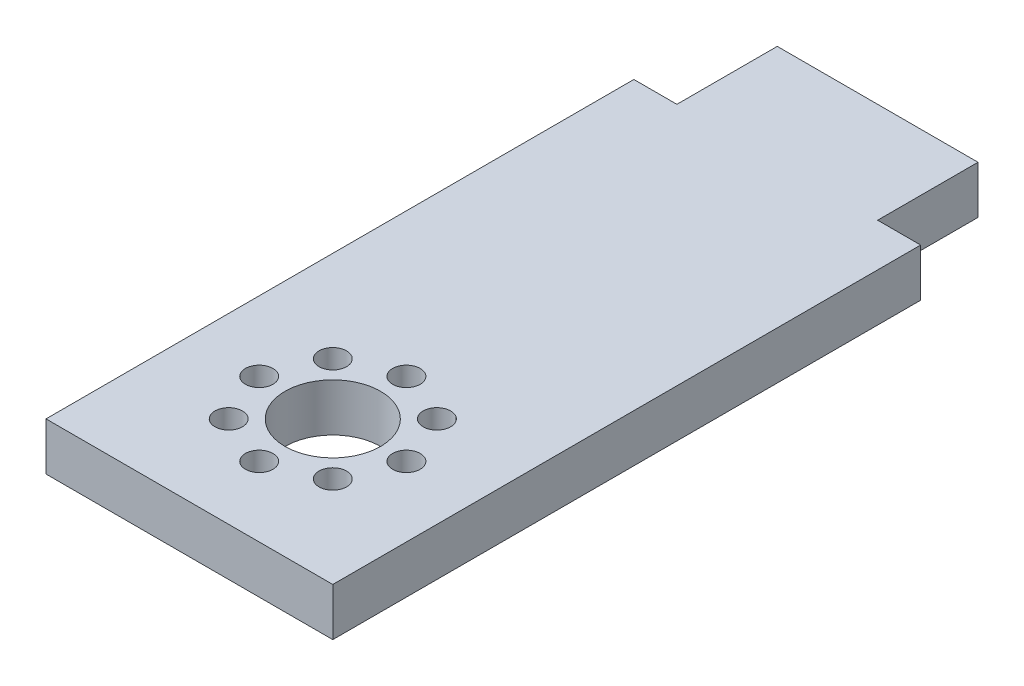
ISO-10303-21;
HEADER;
FILE_DESCRIPTION(('STEP AP214'),'2;1');
FILE_NAME('part.step','',(''),(''),'','','');
FILE_SCHEMA(('AUTOMOTIVE_DESIGN { 1 0 10303 214 1 1 1 1 }'));
ENDSEC;
DATA;
#1=APPLICATION_CONTEXT('core data for automotive mechanical design processes');
#2=APPLICATION_PROTOCOL_DEFINITION('international standard','automotive_design',2000,#1);
#3=PRODUCT_CONTEXT('',#1,'mechanical');
#4=PRODUCT('Part','Part','',(#3));
#5=PRODUCT_RELATED_PRODUCT_CATEGORY('part','',(#4));
#6=PRODUCT_DEFINITION_FORMATION('','',#4);
#7=PRODUCT_DEFINITION_CONTEXT('part definition',#1,'design');
#8=PRODUCT_DEFINITION('design','',#6,#7);
#9=PRODUCT_DEFINITION_SHAPE('','',#8);
#10=(LENGTH_UNIT() NAMED_UNIT(*) SI_UNIT(.MILLI.,.METRE.));
#11=(NAMED_UNIT(*) PLANE_ANGLE_UNIT() SI_UNIT($,.RADIAN.));
#12=(NAMED_UNIT(*) SI_UNIT($,.STERADIAN.) SOLID_ANGLE_UNIT());
#13=UNCERTAINTY_MEASURE_WITH_UNIT(LENGTH_MEASURE(1.E-05),#10,'distance_accuracy_value','');
#14=(GEOMETRIC_REPRESENTATION_CONTEXT(3) GLOBAL_UNCERTAINTY_ASSIGNED_CONTEXT((#13)) GLOBAL_UNIT_ASSIGNED_CONTEXT((#10,
#11,#12)) REPRESENTATION_CONTEXT('',''));
#15=CARTESIAN_POINT('',(0.,0.,0.));
#16=DIRECTION('',(0.,0.,1.));
#17=DIRECTION('',(1.,0.,0.));
#18=AXIS2_PLACEMENT_3D('',#15,#16,#17);
#19=CARTESIAN_POINT('',(3.03552590565576,6.35,-47.3622394100122));
#20=DIRECTION('',(0.,0.,1.));
#21=DIRECTION('',(1.,0.,0.));
#22=AXIS2_PLACEMENT_3D('',#19,#20,#21);
#23=PLANE('',#22);
#24=DIRECTION('',(-1.,0.,0.));
#25=VECTOR('',#24,1.);
#26=CARTESIAN_POINT('',(3.03552590565576,0.,-47.3622394100122));
#27=LINE('',#26,#25);
#28=CARTESIAN_POINT('',(3.03552590565576,0.,-47.3622394100122));
#29=VERTEX_POINT('',#28);
#30=CARTESIAN_POINT('',(-2.68097409434424,0.,-47.3622394100122));
#31=VERTEX_POINT('',#30);
#32=EDGE_CURVE('E199',#29,#31,#27,.T.);
#33=ORIENTED_EDGE('',*,*,#32,.T.);
#34=DIRECTION('',(0.,1.,0.));
#35=VECTOR('',#34,1.);
#36=CARTESIAN_POINT('',(-2.68097409434424,6.35,-47.3622394100122));
#37=LINE('',#36,#35);
#38=CARTESIAN_POINT('',(-2.68097409434424,6.35,-47.3622394100122));
#39=VERTEX_POINT('',#38);
#40=EDGE_CURVE('E11',#31,#39,#37,.T.);
#41=ORIENTED_EDGE('',*,*,#40,.T.);
#42=DIRECTION('',(-1.,0.,0.));
#43=VECTOR('',#42,1.);
#44=CARTESIAN_POINT('',(3.03552590565576,6.35,-47.3622394100122));
#45=LINE('',#44,#43);
#46=CARTESIAN_POINT('',(3.03552590565576,6.35,-47.3622394100122));
#47=VERTEX_POINT('',#46);
#48=EDGE_CURVE('E191',#47,#39,#45,.T.);
#49=ORIENTED_EDGE('',*,*,#48,.F.);
#50=DIRECTION('',(0.,-1.,0.));
#51=VECTOR('',#50,1.);
#52=CARTESIAN_POINT('',(3.03552590565576,6.35,-47.3622394100122));
#53=LINE('',#52,#51);
#54=EDGE_CURVE('E198',#47,#29,#53,.T.);
#55=ORIENTED_EDGE('',*,*,#54,.T.);
#56=EDGE_LOOP('',(#33,#41,#49,#55));
#57=FACE_BOUND('',#56,.T.);
#58=ADVANCED_FACE('F33',(#57),#23,.F.);
#59=CARTESIAN_POINT('',(0.,6.35,0.));
#60=DIRECTION('',(0.,1.,0.));
#61=DIRECTION('',(0.,0.,1.));
#62=AXIS2_PLACEMENT_3D('',#59,#60,#61);
#63=PLANE('',#62);
#64=ORIENTED_EDGE('',*,*,#48,.T.);
#65=DIRECTION('',(0.,0.,-1.));
#66=VECTOR('',#65,1.);
#67=CARTESIAN_POINT('',(-2.68097409434424,6.35,-60.6957394100122));
#68=LINE('',#67,#66);
#69=CARTESIAN_POINT('',(-2.68097409434424,6.35,-60.6957394100122));
#70=VERTEX_POINT('',#69);
#71=EDGE_CURVE('E131',#39,#70,#68,.T.);
#72=ORIENTED_EDGE('',*,*,#71,.T.);
#73=DIRECTION('',(-1.,0.,0.));
#74=VECTOR('',#73,1.);
#75=CARTESIAN_POINT('',(-29.3479740943442,6.35,-60.6957394100122));
#76=LINE('',#75,#74);
#77=CARTESIAN_POINT('',(-29.3479740943442,6.35,-60.6957394100122));
#78=VERTEX_POINT('',#77);
#79=EDGE_CURVE('E120',#70,#78,#76,.T.);
#80=ORIENTED_EDGE('',*,*,#79,.T.);
#81=DIRECTION('',(0.,0.,1.));
#82=VECTOR('',#81,1.);
#83=CARTESIAN_POINT('',(-29.3479740943442,6.35,-60.6957394100122));
#84=LINE('',#83,#82);
#85=CARTESIAN_POINT('',(-29.3479740943442,6.35,-47.3622394100122));
#86=VERTEX_POINT('',#85);
#87=EDGE_CURVE('E48',#78,#86,#84,.T.);
#88=ORIENTED_EDGE('',*,*,#87,.T.);
#89=CARTESIAN_POINT('',(-35.0644740943442,6.35,-47.3622394100122));
#90=VERTEX_POINT('',#89);
#91=EDGE_CURVE('E81',#86,#90,#45,.T.);
#92=ORIENTED_EDGE('',*,*,#91,.T.);
#93=DIRECTION('',(0.,0.,1.));
#94=VECTOR('',#93,1.);
#95=CARTESIAN_POINT('',(-35.0644740943442,6.35,-47.3622394100122));
#96=LINE('',#95,#94);
#97=CARTESIAN_POINT('',(-35.0644740943442,6.35,30.7367605899878));
#98=VERTEX_POINT('',#97);
#99=EDGE_CURVE('E193',#90,#98,#96,.T.);
#100=ORIENTED_EDGE('',*,*,#99,.T.);
#101=DIRECTION('',(1.,0.,0.));
#102=VECTOR('',#101,1.);
#103=CARTESIAN_POINT('',(-35.0644740943442,6.35,30.7367605899878));
#104=LINE('',#103,#102);
#105=CARTESIAN_POINT('',(3.03552590565576,6.35,30.7367605899878));
#106=VERTEX_POINT('',#105);
#107=EDGE_CURVE('E195',#98,#106,#104,.T.);
#108=ORIENTED_EDGE('',*,*,#107,.T.);
#109=DIRECTION('',(0.,0.,-1.));
#110=VECTOR('',#109,1.);
#111=CARTESIAN_POINT('',(3.03552590565576,6.35,30.7367605899878));
#112=LINE('',#111,#110);
#113=EDGE_CURVE('E56',#106,#47,#112,.T.);
#114=ORIENTED_EDGE('',*,*,#113,.T.);
#115=EDGE_LOOP('',(#64,#72,#80,#88,#92,#100,#108,#114));
#116=FACE_BOUND('',#115,.T.);
#117=CARTESIAN_POINT('',(-6.23547409434424,6.35,11.6867605899879));
#118=DIRECTION('',(0.,1.,0.));
#119=DIRECTION('',(0.,0.,1.));
#120=AXIS2_PLACEMENT_3D('',#117,#118,#119);
#121=CIRCLE('',#120,1.8288);
#122=CARTESIAN_POINT('',(-6.23547409434424,6.35,13.5155605899879));
#123=VERTEX_POINT('',#122);
#124=EDGE_CURVE('E143',#123,#123,#121,.T.);
#125=ORIENTED_EDGE('',*,*,#124,.F.);
#126=EDGE_LOOP('',(#125));
#127=FACE_BOUND('',#126,.T.);
#128=CARTESIAN_POINT('',(-16.0144740943442,6.35,1.90776058998778));
#129=DIRECTION('',(0.,1.,0.));
#130=DIRECTION('',(0.,0.,1.));
#131=AXIS2_PLACEMENT_3D('',#128,#129,#130);
#132=CIRCLE('',#131,1.8288);
#133=CARTESIAN_POINT('',(-16.0144740943442,6.35,3.73656058998778));
#134=VERTEX_POINT('',#133);
#135=EDGE_CURVE('E155',#134,#134,#132,.T.);
#136=ORIENTED_EDGE('',*,*,#135,.F.);
#137=EDGE_LOOP('',(#136));
#138=FACE_BOUND('',#137,.T.);
#139=CARTESIAN_POINT('',(-25.7934740943442,6.35,11.6867605899877));
#140=DIRECTION('',(0.,1.,0.));
#141=DIRECTION('',(0.,0.,1.));
#142=AXIS2_PLACEMENT_3D('',#139,#140,#141);
#143=CIRCLE('',#142,1.8288);
#144=CARTESIAN_POINT('',(-25.7934740943442,6.35,13.5155605899877));
#145=VERTEX_POINT('',#144);
#146=EDGE_CURVE('E167',#145,#145,#143,.T.);
#147=ORIENTED_EDGE('',*,*,#146,.F.);
#148=EDGE_LOOP('',(#147));
#149=FACE_BOUND('',#148,.T.);
#150=CARTESIAN_POINT('',(-16.0144740943442,6.35,21.4657605899878));
#151=DIRECTION('',(0.,1.,0.));
#152=DIRECTION('',(0.,0.,1.));
#153=AXIS2_PLACEMENT_3D('',#150,#151,#152);
#154=CIRCLE('',#153,1.8288);
#155=CARTESIAN_POINT('',(-16.0144740943442,6.35,23.2945605899878));
#156=VERTEX_POINT('',#155);
#157=EDGE_CURVE('E179',#156,#156,#154,.T.);
#158=ORIENTED_EDGE('',*,*,#157,.F.);
#159=EDGE_LOOP('',(#158));
#160=FACE_BOUND('',#159,.T.);
#161=CARTESIAN_POINT('',(-16.0144740943442,6.35,11.6867605899878));
#162=DIRECTION('',(0.,1.,0.));
#163=DIRECTION('',(0.,0.,1.));
#164=AXIS2_PLACEMENT_3D('',#161,#162,#163);
#165=CIRCLE('',#164,6.35);
#166=CARTESIAN_POINT('',(-16.0144740943442,6.35,18.0367605899878));
#167=VERTEX_POINT('',#166);
#168=EDGE_CURVE('E185',#167,#167,#165,.T.);
#169=ORIENTED_EDGE('',*,*,#168,.F.);
#170=EDGE_LOOP('',(#169));
#171=FACE_BOUND('',#170,.T.);
#172=CARTESIAN_POINT('',(-22.9292713075675,6.35,18.601557803211));
#173=DIRECTION('',(0.,1.,0.));
#174=DIRECTION('',(0.,0.,1.));
#175=AXIS2_PLACEMENT_3D('',#172,#173,#174);
#176=CIRCLE('',#175,1.8288);
#177=CARTESIAN_POINT('',(-22.9292713075675,6.35,20.430357803211));
#178=VERTEX_POINT('',#177);
#179=EDGE_CURVE('E173',#178,#178,#176,.T.);
#180=ORIENTED_EDGE('',*,*,#179,.F.);
#181=EDGE_LOOP('',(#180));
#182=FACE_BOUND('',#181,.T.);
#183=CARTESIAN_POINT('',(-22.9292713075675,6.35,4.77196337676449));
#184=DIRECTION('',(0.,1.,0.));
#185=DIRECTION('',(0.,0.,1.));
#186=AXIS2_PLACEMENT_3D('',#183,#184,#185);
#187=CIRCLE('',#186,1.8288);
#188=CARTESIAN_POINT('',(-22.9292713075675,6.35,6.60076337676449));
#189=VERTEX_POINT('',#188);
#190=EDGE_CURVE('E161',#189,#189,#187,.T.);
#191=ORIENTED_EDGE('',*,*,#190,.F.);
#192=EDGE_LOOP('',(#191));
#193=FACE_BOUND('',#192,.T.);
#194=CARTESIAN_POINT('',(-9.09967688112094,6.35,4.7719633767646));
#195=DIRECTION('',(0.,1.,0.));
#196=DIRECTION('',(0.,0.,1.));
#197=AXIS2_PLACEMENT_3D('',#194,#195,#196);
#198=CIRCLE('',#197,1.8288);
#199=CARTESIAN_POINT('',(-9.09967688112094,6.35,6.60076337676459));
#200=VERTEX_POINT('',#199);
#201=EDGE_CURVE('E149',#200,#200,#198,.T.);
#202=ORIENTED_EDGE('',*,*,#201,.F.);
#203=EDGE_LOOP('',(#202));
#204=FACE_BOUND('',#203,.T.);
#205=CARTESIAN_POINT('',(-9.09967688112108,6.35,18.6015578032111));
#206=DIRECTION('',(0.,1.,0.));
#207=DIRECTION('',(0.,0.,1.));
#208=AXIS2_PLACEMENT_3D('',#205,#206,#207);
#209=CIRCLE('',#208,1.8288);
#210=CARTESIAN_POINT('',(-9.09967688112108,6.35,20.4303578032111));
#211=VERTEX_POINT('',#210);
#212=EDGE_CURVE('E137',#211,#211,#209,.T.);
#213=ORIENTED_EDGE('',*,*,#212,.F.);
#214=EDGE_LOOP('',(#213));
#215=FACE_BOUND('',#214,.T.);
#216=ADVANCED_FACE('F225',(#116,#127,#138,#149,#160,#171,#182,#193,#204,#215),#63,.T.);
#217=CARTESIAN_POINT('',(0.,0.,0.));
#218=DIRECTION('',(0.,1.,0.));
#219=DIRECTION('',(0.,0.,1.));
#220=AXIS2_PLACEMENT_3D('',#217,#218,#219);
#221=PLANE('',#220);
#222=DIRECTION('',(0.,0.,-1.));
#223=VECTOR('',#222,1.);
#224=CARTESIAN_POINT('',(-2.68097409434424,0.,-60.6957394100122));
#225=LINE('',#224,#223);
#226=CARTESIAN_POINT('',(-2.68097409434424,0.,-60.6957394100122));
#227=VERTEX_POINT('',#226);
#228=EDGE_CURVE('E106',#31,#227,#225,.T.);
#229=ORIENTED_EDGE('',*,*,#228,.F.);
#230=ORIENTED_EDGE('',*,*,#32,.F.);
#231=DIRECTION('',(0.,0.,-1.));
#232=VECTOR('',#231,1.);
#233=CARTESIAN_POINT('',(3.03552590565576,0.,-7.36323941001222));
#234=LINE('',#233,#232);
#235=CARTESIAN_POINT('',(3.03552590565576,0.,30.7367605899878));
#236=VERTEX_POINT('',#235);
#237=EDGE_CURVE('E76',#236,#29,#234,.T.);
#238=ORIENTED_EDGE('',*,*,#237,.F.);
#239=DIRECTION('',(1.,0.,0.));
#240=VECTOR('',#239,1.);
#241=CARTESIAN_POINT('',(-35.0644740943442,0.,30.7367605899878));
#242=LINE('',#241,#240);
#243=CARTESIAN_POINT('',(-35.0644740943442,0.,30.7367605899878));
#244=VERTEX_POINT('',#243);
#245=EDGE_CURVE('E203',#244,#236,#242,.T.);
#246=ORIENTED_EDGE('',*,*,#245,.F.);
#247=DIRECTION('',(0.,0.,1.));
#248=VECTOR('',#247,1.);
#249=CARTESIAN_POINT('',(-35.0644740943442,0.,-7.36323941001221));
#250=LINE('',#249,#248);
#251=CARTESIAN_POINT('',(-35.0644740943442,0.,-47.3622394100122));
#252=VERTEX_POINT('',#251);
#253=EDGE_CURVE('E201',#252,#244,#250,.T.);
#254=ORIENTED_EDGE('',*,*,#253,.F.);
#255=CARTESIAN_POINT('',(-29.3479740943442,0.,-47.3622394100122));
#256=VERTEX_POINT('',#255);
#257=EDGE_CURVE('E188',#256,#252,#27,.T.);
#258=ORIENTED_EDGE('',*,*,#257,.F.);
#259=DIRECTION('',(0.,0.,1.));
#260=VECTOR('',#259,1.);
#261=CARTESIAN_POINT('',(-29.3479740943442,0.,-60.6957394100122));
#262=LINE('',#261,#260);
#263=CARTESIAN_POINT('',(-29.3479740943442,0.,-60.6957394100122));
#264=VERTEX_POINT('',#263);
#265=EDGE_CURVE('E122',#264,#256,#262,.T.);
#266=ORIENTED_EDGE('',*,*,#265,.F.);
#267=DIRECTION('',(-1.,0.,0.));
#268=VECTOR('',#267,1.);
#269=CARTESIAN_POINT('',(-29.3479740943442,0.,-60.6957394100122));
#270=LINE('',#269,#268);
#271=EDGE_CURVE('E115',#227,#264,#270,.T.);
#272=ORIENTED_EDGE('',*,*,#271,.F.);
#273=EDGE_LOOP('',(#229,#230,#238,#246,#254,#258,#266,#272));
#274=FACE_BOUND('',#273,.T.);
#275=CARTESIAN_POINT('',(-16.0144740943442,0.,11.6867605899878));
#276=DIRECTION('',(0.,1.,0.));
#277=DIRECTION('',(0.,0.,1.));
#278=AXIS2_PLACEMENT_3D('',#275,#276,#277);
#279=CIRCLE('',#278,6.35);
#280=CARTESIAN_POINT('',(-16.0144740943442,0.,18.0367605899878));
#281=VERTEX_POINT('',#280);
#282=EDGE_CURVE('E182',#281,#281,#279,.T.);
#283=ORIENTED_EDGE('',*,*,#282,.T.);
#284=EDGE_LOOP('',(#283));
#285=FACE_BOUND('',#284,.T.);
#286=CARTESIAN_POINT('',(-16.0144740943442,0.,21.4657605899878));
#287=DIRECTION('',(0.,1.,0.));
#288=DIRECTION('',(0.,0.,1.));
#289=AXIS2_PLACEMENT_3D('',#286,#287,#288);
#290=CIRCLE('',#289,1.8288);
#291=CARTESIAN_POINT('',(-16.0144740943442,0.,23.2945605899878));
#292=VERTEX_POINT('',#291);
#293=EDGE_CURVE('E176',#292,#292,#290,.T.);
#294=ORIENTED_EDGE('',*,*,#293,.T.);
#295=EDGE_LOOP('',(#294));
#296=FACE_BOUND('',#295,.T.);
#297=CARTESIAN_POINT('',(-22.9292713075675,0.,18.601557803211));
#298=DIRECTION('',(0.,1.,0.));
#299=DIRECTION('',(0.,0.,1.));
#300=AXIS2_PLACEMENT_3D('',#297,#298,#299);
#301=CIRCLE('',#300,1.8288);
#302=CARTESIAN_POINT('',(-22.9292713075675,0.,20.430357803211));
#303=VERTEX_POINT('',#302);
#304=EDGE_CURVE('E170',#303,#303,#301,.T.);
#305=ORIENTED_EDGE('',*,*,#304,.T.);
#306=EDGE_LOOP('',(#305));
#307=FACE_BOUND('',#306,.T.);
#308=CARTESIAN_POINT('',(-25.7934740943442,0.,11.6867605899877));
#309=DIRECTION('',(0.,1.,0.));
#310=DIRECTION('',(0.,0.,1.));
#311=AXIS2_PLACEMENT_3D('',#308,#309,#310);
#312=CIRCLE('',#311,1.8288);
#313=CARTESIAN_POINT('',(-25.7934740943442,0.,13.5155605899877));
#314=VERTEX_POINT('',#313);
#315=EDGE_CURVE('E164',#314,#314,#312,.T.);
#316=ORIENTED_EDGE('',*,*,#315,.T.);
#317=EDGE_LOOP('',(#316));
#318=FACE_BOUND('',#317,.T.);
#319=CARTESIAN_POINT('',(-22.9292713075675,0.,4.77196337676449));
#320=DIRECTION('',(0.,1.,0.));
#321=DIRECTION('',(0.,0.,1.));
#322=AXIS2_PLACEMENT_3D('',#319,#320,#321);
#323=CIRCLE('',#322,1.8288);
#324=CARTESIAN_POINT('',(-22.9292713075675,0.,6.60076337676449));
#325=VERTEX_POINT('',#324);
#326=EDGE_CURVE('E158',#325,#325,#323,.T.);
#327=ORIENTED_EDGE('',*,*,#326,.T.);
#328=EDGE_LOOP('',(#327));
#329=FACE_BOUND('',#328,.T.);
#330=CARTESIAN_POINT('',(-16.0144740943442,0.,1.90776058998778));
#331=DIRECTION('',(0.,1.,0.));
#332=DIRECTION('',(0.,0.,1.));
#333=AXIS2_PLACEMENT_3D('',#330,#331,#332);
#334=CIRCLE('',#333,1.8288);
#335=CARTESIAN_POINT('',(-16.0144740943442,0.,3.73656058998778));
#336=VERTEX_POINT('',#335);
#337=EDGE_CURVE('E152',#336,#336,#334,.T.);
#338=ORIENTED_EDGE('',*,*,#337,.T.);
#339=EDGE_LOOP('',(#338));
#340=FACE_BOUND('',#339,.T.);
#341=CARTESIAN_POINT('',(-9.09967688112094,0.,4.7719633767646));
#342=DIRECTION('',(0.,1.,0.));
#343=DIRECTION('',(0.,0.,1.));
#344=AXIS2_PLACEMENT_3D('',#341,#342,#343);
#345=CIRCLE('',#344,1.8288);
#346=CARTESIAN_POINT('',(-9.09967688112094,0.,6.60076337676459));
#347=VERTEX_POINT('',#346);
#348=EDGE_CURVE('E146',#347,#347,#345,.T.);
#349=ORIENTED_EDGE('',*,*,#348,.T.);
#350=EDGE_LOOP('',(#349));
#351=FACE_BOUND('',#350,.T.);
#352=CARTESIAN_POINT('',(-6.23547409434424,0.,11.6867605899879));
#353=DIRECTION('',(0.,1.,0.));
#354=DIRECTION('',(0.,0.,1.));
#355=AXIS2_PLACEMENT_3D('',#352,#353,#354);
#356=CIRCLE('',#355,1.8288);
#357=CARTESIAN_POINT('',(-6.23547409434424,0.,13.5155605899879));
#358=VERTEX_POINT('',#357);
#359=EDGE_CURVE('E140',#358,#358,#356,.T.);
#360=ORIENTED_EDGE('',*,*,#359,.T.);
#361=EDGE_LOOP('',(#360));
#362=FACE_BOUND('',#361,.T.);
#363=CARTESIAN_POINT('',(-9.09967688112108,0.,18.6015578032111));
#364=DIRECTION('',(0.,1.,0.));
#365=DIRECTION('',(0.,0.,1.));
#366=AXIS2_PLACEMENT_3D('',#363,#364,#365);
#367=CIRCLE('',#366,1.8288);
#368=CARTESIAN_POINT('',(-9.09967688112108,0.,20.4303578032111));
#369=VERTEX_POINT('',#368);
#370=EDGE_CURVE('E135',#369,#369,#367,.T.);
#371=ORIENTED_EDGE('',*,*,#370,.T.);
#372=EDGE_LOOP('',(#371));
#373=FACE_BOUND('',#372,.T.);
#374=ADVANCED_FACE('F125',(#274,#285,#296,#307,#318,#329,#340,#351,#362,#373),#221,.F.);
#375=ORIENTED_EDGE('',*,*,#91,.F.);
#376=DIRECTION('',(0.,-1.,0.));
#377=VECTOR('',#376,1.);
#378=CARTESIAN_POINT('',(-29.3479740943442,6.35,-47.3622394100122));
#379=LINE('',#378,#377);
#380=EDGE_CURVE('E41',#86,#256,#379,.T.);
#381=ORIENTED_EDGE('',*,*,#380,.T.);
#382=ORIENTED_EDGE('',*,*,#257,.T.);
#383=DIRECTION('',(0.,-1.,0.));
#384=VECTOR('',#383,1.);
#385=CARTESIAN_POINT('',(-35.0644740943442,6.35,-47.3622394100122));
#386=LINE('',#385,#384);
#387=EDGE_CURVE('E213',#90,#252,#386,.T.);
#388=ORIENTED_EDGE('',*,*,#387,.F.);
#389=EDGE_LOOP('',(#375,#381,#382,#388));
#390=FACE_BOUND('',#389,.T.);
#391=ADVANCED_FACE('F35',(#390),#23,.F.);
#392=CARTESIAN_POINT('',(-35.0644740943442,6.35,-7.36323941001221));
#393=DIRECTION('',(1.,0.,0.));
#394=DIRECTION('',(0.,0.,-1.));
#395=AXIS2_PLACEMENT_3D('',#392,#393,#394);
#396=PLANE('',#395);
#397=ORIENTED_EDGE('',*,*,#253,.T.);
#398=DIRECTION('',(0.,-1.,0.));
#399=VECTOR('',#398,1.);
#400=CARTESIAN_POINT('',(-35.0644740943442,6.35,30.7367605899878));
#401=LINE('',#400,#399);
#402=EDGE_CURVE('E210',#98,#244,#401,.T.);
#403=ORIENTED_EDGE('',*,*,#402,.F.);
#404=ORIENTED_EDGE('',*,*,#99,.F.);
#405=ORIENTED_EDGE('',*,*,#387,.T.);
#406=EDGE_LOOP('',(#397,#403,#404,#405));
#407=FACE_BOUND('',#406,.T.);
#408=ADVANCED_FACE('F223',(#407),#396,.F.);
#409=CARTESIAN_POINT('',(-35.0644740943442,6.35,30.7367605899878));
#410=DIRECTION('',(0.,0.,-1.));
#411=DIRECTION('',(-1.,0.,0.));
#412=AXIS2_PLACEMENT_3D('',#409,#410,#411);
#413=PLANE('',#412);
#414=ORIENTED_EDGE('',*,*,#245,.T.);
#415=DIRECTION('',(0.,-1.,0.));
#416=VECTOR('',#415,1.);
#417=CARTESIAN_POINT('',(3.03552590565576,6.35,30.7367605899878));
#418=LINE('',#417,#416);
#419=EDGE_CURVE('E208',#106,#236,#418,.T.);
#420=ORIENTED_EDGE('',*,*,#419,.F.);
#421=ORIENTED_EDGE('',*,*,#107,.F.);
#422=ORIENTED_EDGE('',*,*,#402,.T.);
#423=EDGE_LOOP('',(#414,#420,#421,#422));
#424=FACE_BOUND('',#423,.T.);
#425=ADVANCED_FACE('F229',(#424),#413,.F.);
#426=CARTESIAN_POINT('',(3.03552590565576,6.35,-7.36323941001222));
#427=DIRECTION('',(-1.,0.,0.));
#428=DIRECTION('',(0.,0.,1.));
#429=AXIS2_PLACEMENT_3D('',#426,#427,#428);
#430=PLANE('',#429);
#431=ORIENTED_EDGE('',*,*,#237,.T.);
#432=ORIENTED_EDGE('',*,*,#54,.F.);
#433=ORIENTED_EDGE('',*,*,#113,.F.);
#434=ORIENTED_EDGE('',*,*,#419,.T.);
#435=EDGE_LOOP('',(#431,#432,#433,#434));
#436=FACE_BOUND('',#435,.T.);
#437=ADVANCED_FACE('F230',(#436),#430,.F.);
#438=CARTESIAN_POINT('',(-16.0144740943442,6.35,11.6867605899878));
#439=DIRECTION('',(0.,-1.,0.));
#440=DIRECTION('',(0.,0.,-1.));
#441=AXIS2_PLACEMENT_3D('',#438,#439,#440);
#442=CYLINDRICAL_SURFACE('',#441,6.35);
#443=ORIENTED_EDGE('',*,*,#168,.T.);
#444=EDGE_LOOP('',(#443));
#445=FACE_BOUND('',#444,.T.);
#446=ORIENTED_EDGE('',*,*,#282,.F.);
#447=EDGE_LOOP('',(#446));
#448=FACE_BOUND('',#447,.T.);
#449=ADVANCED_FACE('F250',(#445,#448),#442,.F.);
#450=CARTESIAN_POINT('',(-16.0144740943442,6.35,21.4657605899878));
#451=DIRECTION('',(0.,-1.,0.));
#452=DIRECTION('',(0.,0.,-1.));
#453=AXIS2_PLACEMENT_3D('',#450,#451,#452);
#454=CYLINDRICAL_SURFACE('',#453,1.8288);
#455=ORIENTED_EDGE('',*,*,#157,.T.);
#456=EDGE_LOOP('',(#455));
#457=FACE_BOUND('',#456,.T.);
#458=ORIENTED_EDGE('',*,*,#293,.F.);
#459=EDGE_LOOP('',(#458));
#460=FACE_BOUND('',#459,.T.);
#461=ADVANCED_FACE('F266',(#457,#460),#454,.F.);
#462=CARTESIAN_POINT('',(-22.9292713075675,6.35,18.601557803211));
#463=DIRECTION('',(0.,-1.,0.));
#464=DIRECTION('',(0.,0.,-1.));
#465=AXIS2_PLACEMENT_3D('',#462,#463,#464);
#466=CYLINDRICAL_SURFACE('',#465,1.8288);
#467=ORIENTED_EDGE('',*,*,#179,.T.);
#468=EDGE_LOOP('',(#467));
#469=FACE_BOUND('',#468,.T.);
#470=ORIENTED_EDGE('',*,*,#304,.F.);
#471=EDGE_LOOP('',(#470));
#472=FACE_BOUND('',#471,.T.);
#473=ADVANCED_FACE('F273',(#469,#472),#466,.F.);
#474=CARTESIAN_POINT('',(-25.7934740943442,6.35,11.6867605899877));
#475=DIRECTION('',(0.,-1.,0.));
#476=DIRECTION('',(0.,0.,-1.));
#477=AXIS2_PLACEMENT_3D('',#474,#475,#476);
#478=CYLINDRICAL_SURFACE('',#477,1.8288);
#479=ORIENTED_EDGE('',*,*,#146,.T.);
#480=EDGE_LOOP('',(#479));
#481=FACE_BOUND('',#480,.T.);
#482=ORIENTED_EDGE('',*,*,#315,.F.);
#483=EDGE_LOOP('',(#482));
#484=FACE_BOUND('',#483,.T.);
#485=ADVANCED_FACE('F281',(#481,#484),#478,.F.);
#486=CARTESIAN_POINT('',(-22.9292713075675,6.35,4.77196337676449));
#487=DIRECTION('',(0.,-1.,0.));
#488=DIRECTION('',(0.,0.,-1.));
#489=AXIS2_PLACEMENT_3D('',#486,#487,#488);
#490=CYLINDRICAL_SURFACE('',#489,1.8288);
#491=ORIENTED_EDGE('',*,*,#190,.T.);
#492=EDGE_LOOP('',(#491));
#493=FACE_BOUND('',#492,.T.);
#494=ORIENTED_EDGE('',*,*,#326,.F.);
#495=EDGE_LOOP('',(#494));
#496=FACE_BOUND('',#495,.T.);
#497=ADVANCED_FACE('F289',(#493,#496),#490,.F.);
#498=CARTESIAN_POINT('',(-16.0144740943442,6.35,1.90776058998778));
#499=DIRECTION('',(0.,-1.,0.));
#500=DIRECTION('',(0.,0.,-1.));
#501=AXIS2_PLACEMENT_3D('',#498,#499,#500);
#502=CYLINDRICAL_SURFACE('',#501,1.8288);
#503=ORIENTED_EDGE('',*,*,#135,.T.);
#504=EDGE_LOOP('',(#503));
#505=FACE_BOUND('',#504,.T.);
#506=ORIENTED_EDGE('',*,*,#337,.F.);
#507=EDGE_LOOP('',(#506));
#508=FACE_BOUND('',#507,.T.);
#509=ADVANCED_FACE('F297',(#505,#508),#502,.F.);
#510=CARTESIAN_POINT('',(-9.09967688112094,6.35,4.7719633767646));
#511=DIRECTION('',(0.,-1.,0.));
#512=DIRECTION('',(0.,0.,-1.));
#513=AXIS2_PLACEMENT_3D('',#510,#511,#512);
#514=CYLINDRICAL_SURFACE('',#513,1.8288);
#515=ORIENTED_EDGE('',*,*,#201,.T.);
#516=EDGE_LOOP('',(#515));
#517=FACE_BOUND('',#516,.T.);
#518=ORIENTED_EDGE('',*,*,#348,.F.);
#519=EDGE_LOOP('',(#518));
#520=FACE_BOUND('',#519,.T.);
#521=ADVANCED_FACE('F305',(#517,#520),#514,.F.);
#522=CARTESIAN_POINT('',(-6.23547409434424,6.35,11.6867605899879));
#523=DIRECTION('',(0.,-1.,0.));
#524=DIRECTION('',(0.,0.,-1.));
#525=AXIS2_PLACEMENT_3D('',#522,#523,#524);
#526=CYLINDRICAL_SURFACE('',#525,1.8288);
#527=ORIENTED_EDGE('',*,*,#124,.T.);
#528=EDGE_LOOP('',(#527));
#529=FACE_BOUND('',#528,.T.);
#530=ORIENTED_EDGE('',*,*,#359,.F.);
#531=EDGE_LOOP('',(#530));
#532=FACE_BOUND('',#531,.T.);
#533=ADVANCED_FACE('F313',(#529,#532),#526,.F.);
#534=CARTESIAN_POINT('',(-9.09967688112108,6.35,18.6015578032111));
#535=DIRECTION('',(0.,-1.,0.));
#536=DIRECTION('',(0.,0.,-1.));
#537=AXIS2_PLACEMENT_3D('',#534,#535,#536);
#538=CYLINDRICAL_SURFACE('',#537,1.8288);
#539=ORIENTED_EDGE('',*,*,#212,.T.);
#540=EDGE_LOOP('',(#539));
#541=FACE_BOUND('',#540,.T.);
#542=ORIENTED_EDGE('',*,*,#370,.F.);
#543=EDGE_LOOP('',(#542));
#544=FACE_BOUND('',#543,.T.);
#545=ADVANCED_FACE('F321',(#541,#544),#538,.F.);
#546=CARTESIAN_POINT('',(-2.68097409434424,0.,-60.6957394100122));
#547=DIRECTION('',(1.,0.,0.));
#548=DIRECTION('',(0.,0.,-1.));
#549=AXIS2_PLACEMENT_3D('',#546,#547,#548);
#550=PLANE('',#549);
#551=ORIENTED_EDGE('',*,*,#40,.F.);
#552=ORIENTED_EDGE('',*,*,#228,.T.);
#553=DIRECTION('',(0.,1.,0.));
#554=VECTOR('',#553,1.);
#555=CARTESIAN_POINT('',(-2.68097409434424,0.,-60.6957394100122));
#556=LINE('',#555,#554);
#557=EDGE_CURVE('E109',#227,#70,#556,.T.);
#558=ORIENTED_EDGE('',*,*,#557,.T.);
#559=ORIENTED_EDGE('',*,*,#71,.F.);
#560=EDGE_LOOP('',(#551,#552,#558,#559));
#561=FACE_BOUND('',#560,.T.);
#562=ADVANCED_FACE('F108',(#561),#550,.T.);
#563=CARTESIAN_POINT('',(-29.3479740943442,0.,-60.6957394100122));
#564=DIRECTION('',(-1.,0.,0.));
#565=DIRECTION('',(0.,0.,1.));
#566=AXIS2_PLACEMENT_3D('',#563,#564,#565);
#567=PLANE('',#566);
#568=ORIENTED_EDGE('',*,*,#380,.F.);
#569=ORIENTED_EDGE('',*,*,#87,.F.);
#570=DIRECTION('',(0.,1.,0.));
#571=VECTOR('',#570,1.);
#572=CARTESIAN_POINT('',(-29.3479740943442,0.,-60.6957394100122));
#573=LINE('',#572,#571);
#574=EDGE_CURVE('E121',#264,#78,#573,.T.);
#575=ORIENTED_EDGE('',*,*,#574,.F.);
#576=ORIENTED_EDGE('',*,*,#265,.T.);
#577=EDGE_LOOP('',(#568,#569,#575,#576));
#578=FACE_BOUND('',#577,.T.);
#579=ADVANCED_FACE('F336',(#578),#567,.T.);
#580=CARTESIAN_POINT('',(-29.3479740943442,0.,-60.6957394100122));
#581=DIRECTION('',(0.,0.,-1.));
#582=DIRECTION('',(-1.,0.,0.));
#583=AXIS2_PLACEMENT_3D('',#580,#581,#582);
#584=PLANE('',#583);
#585=ORIENTED_EDGE('',*,*,#79,.F.);
#586=ORIENTED_EDGE('',*,*,#557,.F.);
#587=ORIENTED_EDGE('',*,*,#271,.T.);
#588=ORIENTED_EDGE('',*,*,#574,.T.);
#589=EDGE_LOOP('',(#585,#586,#587,#588));
#590=FACE_BOUND('',#589,.T.);
#591=ADVANCED_FACE('F119',(#590),#584,.T.);
#592=CLOSED_SHELL('',(#58,#216,#374,#391,#408,#425,#437,#449,#461,#473,#485,#497,#509,#521,#533,
#545,#562,#579,#591));
#593=MANIFOLD_SOLID_BREP('B2',#592);
#594=ADVANCED_BREP_SHAPE_REPRESENTATION('',(#18,#593),#14);
#595=SHAPE_DEFINITION_REPRESENTATION(#9,#594);
ENDSEC;
END-ISO-10303-21;
